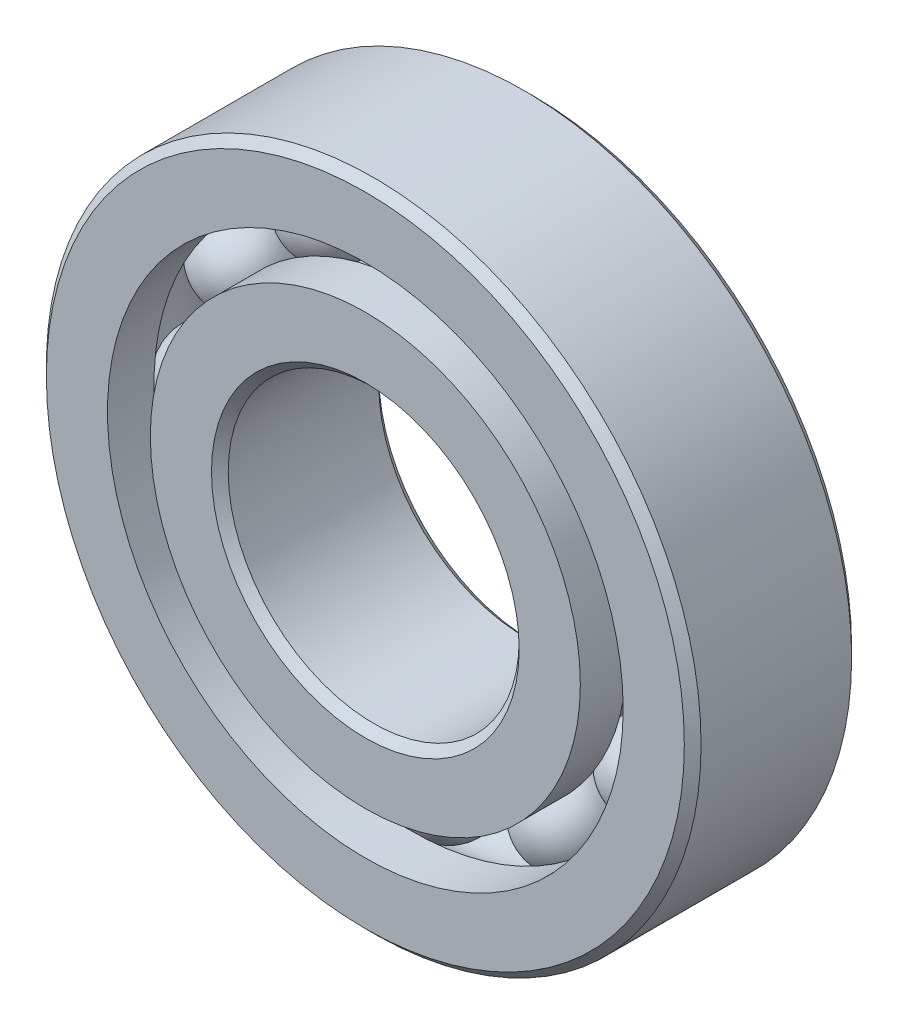
ISO-10303-21;
HEADER;
FILE_DESCRIPTION(('STEP AP214'),'2;1');
FILE_NAME('part.step','',(''),(''),'','','');
FILE_SCHEMA(('AUTOMOTIVE_DESIGN { 1 0 10303 214 1 1 1 1 }'));
ENDSEC;
DATA;
#1=APPLICATION_CONTEXT('core data for automotive mechanical design processes');
#2=APPLICATION_PROTOCOL_DEFINITION('international standard','automotive_design',2000,#1);
#3=PRODUCT_CONTEXT('',#1,'mechanical');
#4=PRODUCT('Part','Part','',(#3));
#5=PRODUCT_RELATED_PRODUCT_CATEGORY('part','',(#4));
#6=PRODUCT_DEFINITION_FORMATION('','',#4);
#7=PRODUCT_DEFINITION_CONTEXT('part definition',#1,'design');
#8=PRODUCT_DEFINITION('design','',#6,#7);
#9=PRODUCT_DEFINITION_SHAPE('','',#8);
#10=(LENGTH_UNIT() NAMED_UNIT(*) SI_UNIT(.MILLI.,.METRE.));
#11=(NAMED_UNIT(*) PLANE_ANGLE_UNIT() SI_UNIT($,.RADIAN.));
#12=(NAMED_UNIT(*) SI_UNIT($,.STERADIAN.) SOLID_ANGLE_UNIT());
#13=UNCERTAINTY_MEASURE_WITH_UNIT(LENGTH_MEASURE(1.E-05),#10,'distance_accuracy_value','');
#14=(GEOMETRIC_REPRESENTATION_CONTEXT(3) GLOBAL_UNCERTAINTY_ASSIGNED_CONTEXT((#13)) GLOBAL_UNIT_ASSIGNED_CONTEXT((#10,
#11,#12)) REPRESENTATION_CONTEXT('',''));
#15=CARTESIAN_POINT('',(0.,0.,0.));
#16=DIRECTION('',(0.,0.,1.));
#17=DIRECTION('',(1.,0.,0.));
#18=AXIS2_PLACEMENT_3D('',#15,#16,#17);
#19=CARTESIAN_POINT('',(-16.2499999999996,28.1458256229945,0.));
#20=DIRECTION('',(0.,0.,1.));
#21=DIRECTION('',(-0.499999999999989,0.866025403784445,0.));
#22=AXIS2_PLACEMENT_3D('',#19,#20,#21);
#23=SPHERICAL_SURFACE('',#22,5.89888170923235);
#24=CARTESIAN_POINT('',(-16.2499999999996,28.1458256229945,5.89888170923235));
#25=VERTEX_POINT('',#24);
#26=VERTEX_LOOP('',#25);
#27=FACE_BOUND('',#26,.T.);
#28=ADVANCED_FACE('F49',(#27),#23,.T.);
#29=CLOSED_SHELL('',(#28));
#30=MANIFOLD_SOLID_BREP('B2',#29);
#31=CARTESIAN_POINT('',(-28.1458256229941,16.2500000000003,0.));
#32=DIRECTION('',(0.,0.,1.));
#33=DIRECTION('',(-0.866025403784433,0.50000000000001,0.));
#34=AXIS2_PLACEMENT_3D('',#31,#32,#33);
#35=SPHERICAL_SURFACE('',#34,5.89888170923235);
#36=CARTESIAN_POINT('',(-28.1458256229941,16.2500000000003,5.89888170923235));
#37=VERTEX_POINT('',#36);
#38=VERTEX_LOOP('',#37);
#39=FACE_BOUND('',#38,.T.);
#40=ADVANCED_FACE('F73',(#39),#35,.T.);
#41=CLOSED_SHELL('',(#40));
#42=MANIFOLD_SOLID_BREP('B7',#41);
#43=CARTESIAN_POINT('',(-32.5,3.40419430537206E-13,0.));
#44=DIRECTION('',(0.,0.,1.));
#45=DIRECTION('',(-1.,0.,0.));
#46=AXIS2_PLACEMENT_3D('',#43,#44,#45);
#47=SPHERICAL_SURFACE('',#46,5.89888170923235);
#48=CARTESIAN_POINT('',(-32.5,3.40419430537206E-13,5.89888170923235));
#49=VERTEX_POINT('',#48);
#50=VERTEX_LOOP('',#49);
#51=FACE_BOUND('',#50,.T.);
#52=ADVANCED_FACE('F94',(#51),#47,.T.);
#53=CLOSED_SHELL('',(#52));
#54=MANIFOLD_SOLID_BREP('B45',#53);
#55=CARTESIAN_POINT('',(-28.1458256229944,-16.2499999999997,0.));
#56=DIRECTION('',(0.,0.,1.));
#57=DIRECTION('',(-0.866025403784443,-0.499999999999992,0.));
#58=AXIS2_PLACEMENT_3D('',#55,#56,#57);
#59=SPHERICAL_SURFACE('',#58,5.89888170923235);
#60=CARTESIAN_POINT('',(-28.1458256229944,-16.2499999999997,5.89888170923235));
#61=VERTEX_POINT('',#60);
#62=VERTEX_LOOP('',#61);
#63=FACE_BOUND('',#62,.T.);
#64=ADVANCED_FACE('F116',(#63),#59,.T.);
#65=CLOSED_SHELL('',(#64));
#66=MANIFOLD_SOLID_BREP('B69',#65);
#67=CARTESIAN_POINT('',(-16.2500000000002,-28.1458256229941,0.));
#68=DIRECTION('',(0.,0.,1.));
#69=DIRECTION('',(-0.500000000000007,-0.866025403784435,0.));
#70=AXIS2_PLACEMENT_3D('',#67,#68,#69);
#71=SPHERICAL_SURFACE('',#70,5.89888170923235);
#72=CARTESIAN_POINT('',(-16.2500000000002,-28.1458256229941,5.89888170923235));
#73=VERTEX_POINT('',#72);
#74=VERTEX_LOOP('',#73);
#75=FACE_BOUND('',#74,.T.);
#76=ADVANCED_FACE('F140',(#75),#71,.T.);
#77=CLOSED_SHELL('',(#76));
#78=MANIFOLD_SOLID_BREP('B90',#77);
#79=CARTESIAN_POINT('',(-2.26946287024804E-13,-32.5,0.));
#80=DIRECTION('',(0.,0.,1.));
#81=DIRECTION('',(0.,-1.,0.));
#82=AXIS2_PLACEMENT_3D('',#79,#80,#81);
#83=SPHERICAL_SURFACE('',#82,5.89888170923235);
#84=CARTESIAN_POINT('',(-2.26946287024804E-13,-32.5,5.89888170923235));
#85=VERTEX_POINT('',#84);
#86=VERTEX_LOOP('',#85);
#87=FACE_BOUND('',#86,.T.);
#88=ADVANCED_FACE('F162',(#87),#83,.T.);
#89=CLOSED_SHELL('',(#88));
#90=MANIFOLD_SOLID_BREP('B112',#89);
#91=CARTESIAN_POINT('',(16.2499999999998,-28.1458256229944,0.));
#92=DIRECTION('',(0.,0.,1.));
#93=DIRECTION('',(0.499999999999995,-0.866025403784442,0.));
#94=AXIS2_PLACEMENT_3D('',#91,#92,#93);
#95=SPHERICAL_SURFACE('',#94,5.89888170923235);
#96=CARTESIAN_POINT('',(16.2499999999998,-28.1458256229944,5.89888170923235));
#97=VERTEX_POINT('',#96);
#98=VERTEX_LOOP('',#97);
#99=FACE_BOUND('',#98,.T.);
#100=ADVANCED_FACE('F188',(#99),#95,.T.);
#101=CLOSED_SHELL('',(#100));
#102=MANIFOLD_SOLID_BREP('B136',#101);
#103=CARTESIAN_POINT('',(28.1458256229942,-16.2500000000001,0.));
#104=DIRECTION('',(0.,0.,1.));
#105=DIRECTION('',(0.866025403784436,-0.500000000000004,0.));
#106=AXIS2_PLACEMENT_3D('',#103,#104,#105);
#107=SPHERICAL_SURFACE('',#106,5.89888170923235);
#108=CARTESIAN_POINT('',(28.1458256229942,-16.2500000000001,5.89888170923235));
#109=VERTEX_POINT('',#108);
#110=VERTEX_LOOP('',#109);
#111=FACE_BOUND('',#110,.T.);
#112=ADVANCED_FACE('F213',(#111),#107,.T.);
#113=CLOSED_SHELL('',(#112));
#114=MANIFOLD_SOLID_BREP('B158',#113);
#115=CARTESIAN_POINT('',(32.5,-1.13473143512402E-13,0.));
#116=DIRECTION('',(0.,0.,1.));
#117=DIRECTION('',(1.,0.,0.));
#118=AXIS2_PLACEMENT_3D('',#115,#116,#117);
#119=SPHERICAL_SURFACE('',#118,5.89888170923235);
#120=CARTESIAN_POINT('',(32.5,-1.13473143512402E-13,5.89888170923235));
#121=VERTEX_POINT('',#120);
#122=VERTEX_LOOP('',#121);
#123=FACE_BOUND('',#122,.T.);
#124=ADVANCED_FACE('F237',(#123),#119,.T.);
#125=CLOSED_SHELL('',(#124));
#126=MANIFOLD_SOLID_BREP('B184',#125);
#127=CARTESIAN_POINT('',(28.1458256229943,16.2499999999999,0.));
#128=DIRECTION('',(0.,0.,1.));
#129=DIRECTION('',(0.86602540378444,0.499999999999998,0.));
#130=AXIS2_PLACEMENT_3D('',#127,#128,#129);
#131=SPHERICAL_SURFACE('',#130,5.89888170923235);
#132=CARTESIAN_POINT('',(28.1458256229943,16.2499999999999,5.89888170923235));
#133=VERTEX_POINT('',#132);
#134=VERTEX_LOOP('',#133);
#135=FACE_BOUND('',#134,.T.);
#136=ADVANCED_FACE('F259',(#135),#131,.T.);
#137=CLOSED_SHELL('',(#136));
#138=MANIFOLD_SOLID_BREP('B209',#137);
#139=CARTESIAN_POINT('',(16.25,28.1458256229942,0.));
#140=DIRECTION('',(0.,0.,1.));
#141=DIRECTION('',(0.500000000000001,0.866025403784438,0.));
#142=AXIS2_PLACEMENT_3D('',#139,#140,#141);
#143=SPHERICAL_SURFACE('',#142,5.89888170923235);
#144=CARTESIAN_POINT('',(16.25,28.1458256229942,5.89888170923235));
#145=VERTEX_POINT('',#144);
#146=VERTEX_LOOP('',#145);
#147=FACE_BOUND('',#146,.T.);
#148=ADVANCED_FACE('F285',(#147),#143,.T.);
#149=CLOSED_SHELL('',(#148));
#150=MANIFOLD_SOLID_BREP('B233',#149);
#151=CARTESIAN_POINT('',(0.,32.5,0.));
#152=DIRECTION('',(0.,0.,1.));
#153=DIRECTION('',(0.,1.,0.));
#154=AXIS2_PLACEMENT_3D('',#151,#152,#153);
#155=SPHERICAL_SURFACE('',#154,5.89888170923235);
#156=CARTESIAN_POINT('',(0.,32.5,5.89888170923235));
#157=VERTEX_POINT('',#156);
#158=VERTEX_LOOP('',#157);
#159=FACE_BOUND('',#158,.T.);
#160=ADVANCED_FACE('F313',(#159),#155,.T.);
#161=CLOSED_SHELL('',(#160));
#162=MANIFOLD_SOLID_BREP('B255',#161);
#163=CARTESIAN_POINT('',(0.,29.5549450549451,11.5));
#164=DIRECTION('',(0.,0.,-1.));
#165=DIRECTION('',(-1.,0.,0.));
#166=AXIS2_PLACEMENT_3D('',#163,#164,#165);
#167=PLANE('',#166);
#168=CARTESIAN_POINT('',(0.,0.,11.5));
#169=DIRECTION('',(0.,0.,1.));
#170=DIRECTION('',(1.,0.,0.));
#171=AXIS2_PLACEMENT_3D('',#168,#169,#170);
#172=CIRCLE('',#171,21.15);
#173=CARTESIAN_POINT('',(21.15,0.,11.5));
#174=VERTEX_POINT('',#173);
#175=EDGE_CURVE('E369',#174,#174,#172,.T.);
#176=ORIENTED_EDGE('',*,*,#175,.F.);
#177=EDGE_LOOP('',(#176));
#178=FACE_BOUND('',#177,.T.);
#179=CARTESIAN_POINT('',(0.,0.,11.5));
#180=DIRECTION('',(0.,0.,1.));
#181=DIRECTION('',(1.,0.,0.));
#182=AXIS2_PLACEMENT_3D('',#179,#180,#181);
#183=CIRCLE('',#182,29.5549450549451);
#184=CARTESIAN_POINT('',(29.5549450549451,0.,11.5));
#185=VERTEX_POINT('',#184);
#186=EDGE_CURVE('E312',#185,#185,#183,.T.);
#187=ORIENTED_EDGE('',*,*,#186,.T.);
#188=EDGE_LOOP('',(#187));
#189=FACE_BOUND('',#188,.T.);
#190=ADVANCED_FACE('F341',(#178,#189),#167,.F.);
#191=CARTESIAN_POINT('',(0.,0.,11.5));
#192=DIRECTION('',(0.,0.,1.));
#193=DIRECTION('',(1.,0.,0.));
#194=AXIS2_PLACEMENT_3D('',#191,#192,#193);
#195=CYLINDRICAL_SURFACE('',#194,29.5549450549451);
#196=ORIENTED_EDGE('',*,*,#186,.F.);
#197=EDGE_LOOP('',(#196));
#198=FACE_BOUND('',#197,.T.);
#199=CARTESIAN_POINT('',(0.,0.,5.11111111111111));
#200=DIRECTION('',(0.,0.,1.));
#201=DIRECTION('',(1.,0.,0.));
#202=AXIS2_PLACEMENT_3D('',#199,#200,#201);
#203=CIRCLE('',#202,29.5549450549451);
#204=CARTESIAN_POINT('',(29.5549450549451,0.,5.11111111111111));
#205=VERTEX_POINT('',#204);
#206=EDGE_CURVE('E347',#205,#205,#203,.T.);
#207=ORIENTED_EDGE('',*,*,#206,.T.);
#208=EDGE_LOOP('',(#207));
#209=FACE_BOUND('',#208,.T.);
#210=ADVANCED_FACE('F376',(#198,#209),#195,.T.);
#211=CARTESIAN_POINT('',(0.,0.,0.));
#212=DIRECTION('',(0.,0.,1.));
#213=DIRECTION('',(1.,0.,0.));
#214=AXIS2_PLACEMENT_3D('',#211,#212,#213);
#215=TOROIDAL_SURFACE('',#214,32.5,5.89888170923234);
#216=ORIENTED_EDGE('',*,*,#206,.F.);
#217=EDGE_LOOP('',(#216));
#218=FACE_BOUND('',#217,.T.);
#219=CARTESIAN_POINT('',(0.,0.,-5.11111111111112));
#220=DIRECTION('',(0.,0.,1.));
#221=DIRECTION('',(1.,0.,0.));
#222=AXIS2_PLACEMENT_3D('',#219,#220,#221);
#223=CIRCLE('',#222,29.554945054945);
#224=CARTESIAN_POINT('',(29.554945054945,0.,-5.11111111111112));
#225=VERTEX_POINT('',#224);
#226=EDGE_CURVE('E351',#225,#225,#223,.T.);
#227=ORIENTED_EDGE('',*,*,#226,.T.);
#228=EDGE_LOOP('',(#227));
#229=FACE_BOUND('',#228,.T.);
#230=ADVANCED_FACE('F380',(#218,#229),#215,.F.);
#231=CARTESIAN_POINT('',(0.,0.,11.5));
#232=DIRECTION('',(0.,0.,1.));
#233=DIRECTION('',(1.,0.,0.));
#234=AXIS2_PLACEMENT_3D('',#231,#232,#233);
#235=CYLINDRICAL_SURFACE('',#234,29.5549450549451);
#236=ORIENTED_EDGE('',*,*,#226,.F.);
#237=EDGE_LOOP('',(#236));
#238=FACE_BOUND('',#237,.T.);
#239=CARTESIAN_POINT('',(0.,0.,-11.5));
#240=DIRECTION('',(0.,0.,1.));
#241=DIRECTION('',(1.,0.,0.));
#242=AXIS2_PLACEMENT_3D('',#239,#240,#241);
#243=CIRCLE('',#242,29.5549450549451);
#244=CARTESIAN_POINT('',(29.5549450549451,0.,-11.5));
#245=VERTEX_POINT('',#244);
#246=EDGE_CURVE('E355',#245,#245,#243,.T.);
#247=ORIENTED_EDGE('',*,*,#246,.T.);
#248=EDGE_LOOP('',(#247));
#249=FACE_BOUND('',#248,.T.);
#250=ADVANCED_FACE('F385',(#238,#249),#235,.T.);
#251=CARTESIAN_POINT('',(0.,21.15,-11.5));
#252=DIRECTION('',(0.,0.,1.));
#253=DIRECTION('',(1.,0.,0.));
#254=AXIS2_PLACEMENT_3D('',#251,#252,#253);
#255=PLANE('',#254);
#256=ORIENTED_EDGE('',*,*,#246,.F.);
#257=EDGE_LOOP('',(#256));
#258=FACE_BOUND('',#257,.T.);
#259=CARTESIAN_POINT('',(0.,0.,-11.5));
#260=DIRECTION('',(0.,0.,1.));
#261=DIRECTION('',(1.,0.,0.));
#262=AXIS2_PLACEMENT_3D('',#259,#260,#261);
#263=CIRCLE('',#262,21.15);
#264=CARTESIAN_POINT('',(21.15,0.,-11.5));
#265=VERTEX_POINT('',#264);
#266=EDGE_CURVE('E360',#265,#265,#263,.T.);
#267=ORIENTED_EDGE('',*,*,#266,.T.);
#268=EDGE_LOOP('',(#267));
#269=FACE_BOUND('',#268,.T.);
#270=ADVANCED_FACE('F391',(#258,#269),#255,.F.);
#271=CARTESIAN_POINT('',(0.,0.,-10.35));
#272=DIRECTION('',(0.,0.,-1.));
#273=DIRECTION('',(-1.,0.,0.));
#274=AXIS2_PLACEMENT_3D('',#271,#272,#273);
#275=CONICAL_SURFACE('',#274,20.,0.78539816339745);
#276=ORIENTED_EDGE('',*,*,#266,.F.);
#277=EDGE_LOOP('',(#276));
#278=FACE_BOUND('',#277,.T.);
#279=CARTESIAN_POINT('',(0.,0.,-10.35));
#280=DIRECTION('',(0.,0.,1.));
#281=DIRECTION('',(1.,0.,0.));
#282=AXIS2_PLACEMENT_3D('',#279,#280,#281);
#283=CIRCLE('',#282,20.);
#284=CARTESIAN_POINT('',(20.,0.,-10.35));
#285=VERTEX_POINT('',#284);
#286=EDGE_CURVE('E363',#285,#285,#283,.T.);
#287=ORIENTED_EDGE('',*,*,#286,.T.);
#288=EDGE_LOOP('',(#287));
#289=FACE_BOUND('',#288,.T.);
#290=ADVANCED_FACE('F395',(#278,#289),#275,.F.);
#291=CARTESIAN_POINT('',(0.,0.,11.5));
#292=DIRECTION('',(0.,0.,1.));
#293=DIRECTION('',(1.,0.,0.));
#294=AXIS2_PLACEMENT_3D('',#291,#292,#293);
#295=CYLINDRICAL_SURFACE('',#294,20.);
#296=ORIENTED_EDGE('',*,*,#286,.F.);
#297=EDGE_LOOP('',(#296));
#298=FACE_BOUND('',#297,.T.);
#299=CARTESIAN_POINT('',(0.,0.,10.35));
#300=DIRECTION('',(0.,0.,1.));
#301=DIRECTION('',(1.,0.,0.));
#302=AXIS2_PLACEMENT_3D('',#299,#300,#301);
#303=CIRCLE('',#302,20.);
#304=CARTESIAN_POINT('',(20.,0.,10.35));
#305=VERTEX_POINT('',#304);
#306=EDGE_CURVE('E366',#305,#305,#303,.T.);
#307=ORIENTED_EDGE('',*,*,#306,.T.);
#308=EDGE_LOOP('',(#307));
#309=FACE_BOUND('',#308,.T.);
#310=ADVANCED_FACE('F399',(#298,#309),#295,.F.);
#311=CARTESIAN_POINT('',(0.,0.,11.5));
#312=DIRECTION('',(0.,0.,1.));
#313=DIRECTION('',(1.,0.,0.));
#314=AXIS2_PLACEMENT_3D('',#311,#312,#313);
#315=CONICAL_SURFACE('',#314,21.15,0.785398163397446);
#316=ORIENTED_EDGE('',*,*,#306,.F.);
#317=EDGE_LOOP('',(#316));
#318=FACE_BOUND('',#317,.T.);
#319=ORIENTED_EDGE('',*,*,#175,.T.);
#320=EDGE_LOOP('',(#319));
#321=FACE_BOUND('',#320,.T.);
#322=ADVANCED_FACE('F373',(#318,#321),#315,.F.);
#323=CLOSED_SHELL('',(#190,#210,#230,#250,#270,#290,#310,#322));
#324=MANIFOLD_SOLID_BREP('B281',#323);
#325=CARTESIAN_POINT('',(0.,0.,10.35));
#326=DIRECTION('',(0.,0.,-1.));
#327=DIRECTION('',(-1.,0.,0.));
#328=AXIS2_PLACEMENT_3D('',#325,#326,#327);
#329=CONICAL_SURFACE('',#328,45.,0.785398163397448);
#330=CARTESIAN_POINT('',(0.,0.,11.5));
#331=DIRECTION('',(0.,0.,1.));
#332=DIRECTION('',(1.,0.,0.));
#333=AXIS2_PLACEMENT_3D('',#330,#331,#332);
#334=CIRCLE('',#333,43.85);
#335=CARTESIAN_POINT('',(43.85,0.,11.5));
#336=VERTEX_POINT('',#335);
#337=EDGE_CURVE('E497',#336,#336,#334,.T.);
#338=ORIENTED_EDGE('',*,*,#337,.F.);
#339=EDGE_LOOP('',(#338));
#340=FACE_BOUND('',#339,.T.);
#341=CARTESIAN_POINT('',(0.,0.,10.35));
#342=DIRECTION('',(0.,0.,1.));
#343=DIRECTION('',(1.,0.,0.));
#344=AXIS2_PLACEMENT_3D('',#341,#342,#343);
#345=CIRCLE('',#344,45.);
#346=CARTESIAN_POINT('',(45.,0.,10.35));
#347=VERTEX_POINT('',#346);
#348=EDGE_CURVE('E340',#347,#347,#345,.T.);
#349=ORIENTED_EDGE('',*,*,#348,.T.);
#350=EDGE_LOOP('',(#349));
#351=FACE_BOUND('',#350,.T.);
#352=ADVANCED_FACE('F469',(#340,#351),#329,.T.);
#353=CARTESIAN_POINT('',(0.,0.,11.5));
#354=DIRECTION('',(0.,0.,1.));
#355=DIRECTION('',(1.,0.,0.));
#356=AXIS2_PLACEMENT_3D('',#353,#354,#355);
#357=CYLINDRICAL_SURFACE('',#356,45.);
#358=ORIENTED_EDGE('',*,*,#348,.F.);
#359=EDGE_LOOP('',(#358));
#360=FACE_BOUND('',#359,.T.);
#361=CARTESIAN_POINT('',(0.,0.,-10.35));
#362=DIRECTION('',(0.,0.,1.));
#363=DIRECTION('',(1.,0.,0.));
#364=AXIS2_PLACEMENT_3D('',#361,#362,#363);
#365=CIRCLE('',#364,45.);
#366=CARTESIAN_POINT('',(45.,0.,-10.35));
#367=VERTEX_POINT('',#366);
#368=EDGE_CURVE('E475',#367,#367,#365,.T.);
#369=ORIENTED_EDGE('',*,*,#368,.T.);
#370=EDGE_LOOP('',(#369));
#371=FACE_BOUND('',#370,.T.);
#372=ADVANCED_FACE('F504',(#360,#371),#357,.T.);
#373=CARTESIAN_POINT('',(0.,0.,-11.5));
#374=DIRECTION('',(0.,0.,1.));
#375=DIRECTION('',(1.,0.,0.));
#376=AXIS2_PLACEMENT_3D('',#373,#374,#375);
#377=CONICAL_SURFACE('',#376,43.85,0.785398163397448);
#378=ORIENTED_EDGE('',*,*,#368,.F.);
#379=EDGE_LOOP('',(#378));
#380=FACE_BOUND('',#379,.T.);
#381=CARTESIAN_POINT('',(0.,0.,-11.5));
#382=DIRECTION('',(0.,0.,1.));
#383=DIRECTION('',(1.,0.,0.));
#384=AXIS2_PLACEMENT_3D('',#381,#382,#383);
#385=CIRCLE('',#384,43.85);
#386=CARTESIAN_POINT('',(43.85,0.,-11.5));
#387=VERTEX_POINT('',#386);
#388=EDGE_CURVE('E479',#387,#387,#385,.T.);
#389=ORIENTED_EDGE('',*,*,#388,.T.);
#390=EDGE_LOOP('',(#389));
#391=FACE_BOUND('',#390,.T.);
#392=ADVANCED_FACE('F508',(#380,#391),#377,.T.);
#393=CARTESIAN_POINT('',(0.,43.85,-11.5));
#394=DIRECTION('',(0.,0.,1.));
#395=DIRECTION('',(1.,0.,0.));
#396=AXIS2_PLACEMENT_3D('',#393,#394,#395);
#397=PLANE('',#396);
#398=ORIENTED_EDGE('',*,*,#388,.F.);
#399=EDGE_LOOP('',(#398));
#400=FACE_BOUND('',#399,.T.);
#401=CARTESIAN_POINT('',(0.,0.,-11.5));
#402=DIRECTION('',(0.,0.,1.));
#403=DIRECTION('',(1.,0.,0.));
#404=AXIS2_PLACEMENT_3D('',#401,#402,#403);
#405=CIRCLE('',#404,35.4450549450549);
#406=CARTESIAN_POINT('',(35.4450549450549,0.,-11.5));
#407=VERTEX_POINT('',#406);
#408=EDGE_CURVE('E483',#407,#407,#405,.T.);
#409=ORIENTED_EDGE('',*,*,#408,.T.);
#410=EDGE_LOOP('',(#409));
#411=FACE_BOUND('',#410,.T.);
#412=ADVANCED_FACE('F513',(#400,#411),#397,.F.);
#413=CARTESIAN_POINT('',(0.,0.,11.5));
#414=DIRECTION('',(0.,0.,1.));
#415=DIRECTION('',(1.,0.,0.));
#416=AXIS2_PLACEMENT_3D('',#413,#414,#415);
#417=CYLINDRICAL_SURFACE('',#416,35.4450549450549);
#418=ORIENTED_EDGE('',*,*,#408,.F.);
#419=EDGE_LOOP('',(#418));
#420=FACE_BOUND('',#419,.T.);
#421=CARTESIAN_POINT('',(0.,0.,-5.11111111111111));
#422=DIRECTION('',(0.,0.,1.));
#423=DIRECTION('',(1.,0.,0.));
#424=AXIS2_PLACEMENT_3D('',#421,#422,#423);
#425=CIRCLE('',#424,35.4450549450549);
#426=CARTESIAN_POINT('',(35.4450549450549,0.,-5.11111111111111));
#427=VERTEX_POINT('',#426);
#428=EDGE_CURVE('E488',#427,#427,#425,.T.);
#429=ORIENTED_EDGE('',*,*,#428,.T.);
#430=EDGE_LOOP('',(#429));
#431=FACE_BOUND('',#430,.T.);
#432=ADVANCED_FACE('F519',(#420,#431),#417,.F.);
#433=CARTESIAN_POINT('',(0.,0.,0.));
#434=DIRECTION('',(0.,0.,1.));
#435=DIRECTION('',(1.,0.,0.));
#436=AXIS2_PLACEMENT_3D('',#433,#434,#435);
#437=TOROIDAL_SURFACE('',#436,32.5,5.89888170923236);
#438=ORIENTED_EDGE('',*,*,#428,.F.);
#439=EDGE_LOOP('',(#438));
#440=FACE_BOUND('',#439,.T.);
#441=CARTESIAN_POINT('',(0.,0.,5.11111111111111));
#442=DIRECTION('',(0.,0.,1.));
#443=DIRECTION('',(1.,0.,0.));
#444=AXIS2_PLACEMENT_3D('',#441,#442,#443);
#445=CIRCLE('',#444,35.4450549450549);
#446=CARTESIAN_POINT('',(35.4450549450549,0.,5.11111111111111));
#447=VERTEX_POINT('',#446);
#448=EDGE_CURVE('E491',#447,#447,#445,.T.);
#449=ORIENTED_EDGE('',*,*,#448,.T.);
#450=EDGE_LOOP('',(#449));
#451=FACE_BOUND('',#450,.T.);
#452=ADVANCED_FACE('F523',(#440,#451),#437,.F.);
#453=CARTESIAN_POINT('',(0.,0.,11.5));
#454=DIRECTION('',(0.,0.,1.));
#455=DIRECTION('',(1.,0.,0.));
#456=AXIS2_PLACEMENT_3D('',#453,#454,#455);
#457=CYLINDRICAL_SURFACE('',#456,35.4450549450549);
#458=ORIENTED_EDGE('',*,*,#448,.F.);
#459=EDGE_LOOP('',(#458));
#460=FACE_BOUND('',#459,.T.);
#461=CARTESIAN_POINT('',(0.,0.,11.5));
#462=DIRECTION('',(0.,0.,1.));
#463=DIRECTION('',(1.,0.,0.));
#464=AXIS2_PLACEMENT_3D('',#461,#462,#463);
#465=CIRCLE('',#464,35.4450549450549);
#466=CARTESIAN_POINT('',(35.4450549450549,0.,11.5));
#467=VERTEX_POINT('',#466);
#468=EDGE_CURVE('E494',#467,#467,#465,.T.);
#469=ORIENTED_EDGE('',*,*,#468,.T.);
#470=EDGE_LOOP('',(#469));
#471=FACE_BOUND('',#470,.T.);
#472=ADVANCED_FACE('F527',(#460,#471),#457,.F.);
#473=CARTESIAN_POINT('',(0.,43.85,11.5));
#474=DIRECTION('',(0.,0.,-1.));
#475=DIRECTION('',(-1.,0.,0.));
#476=AXIS2_PLACEMENT_3D('',#473,#474,#475);
#477=PLANE('',#476);
#478=ORIENTED_EDGE('',*,*,#468,.F.);
#479=EDGE_LOOP('',(#478));
#480=FACE_BOUND('',#479,.T.);
#481=ORIENTED_EDGE('',*,*,#337,.T.);
#482=EDGE_LOOP('',(#481));
#483=FACE_BOUND('',#482,.T.);
#484=ADVANCED_FACE('F501',(#480,#483),#477,.F.);
#485=CLOSED_SHELL('',(#352,#372,#392,#412,#432,#452,#472,#484));
#486=MANIFOLD_SOLID_BREP('B307',#485);
#487=ADVANCED_BREP_SHAPE_REPRESENTATION('',(#18,#30,#42,#54,#66,#78,#90,#102,#114,#126,#138,
#150,#162,#324,#486),#14);
#488=SHAPE_DEFINITION_REPRESENTATION(#9,#487);
ENDSEC;
END-ISO-10303-21;
